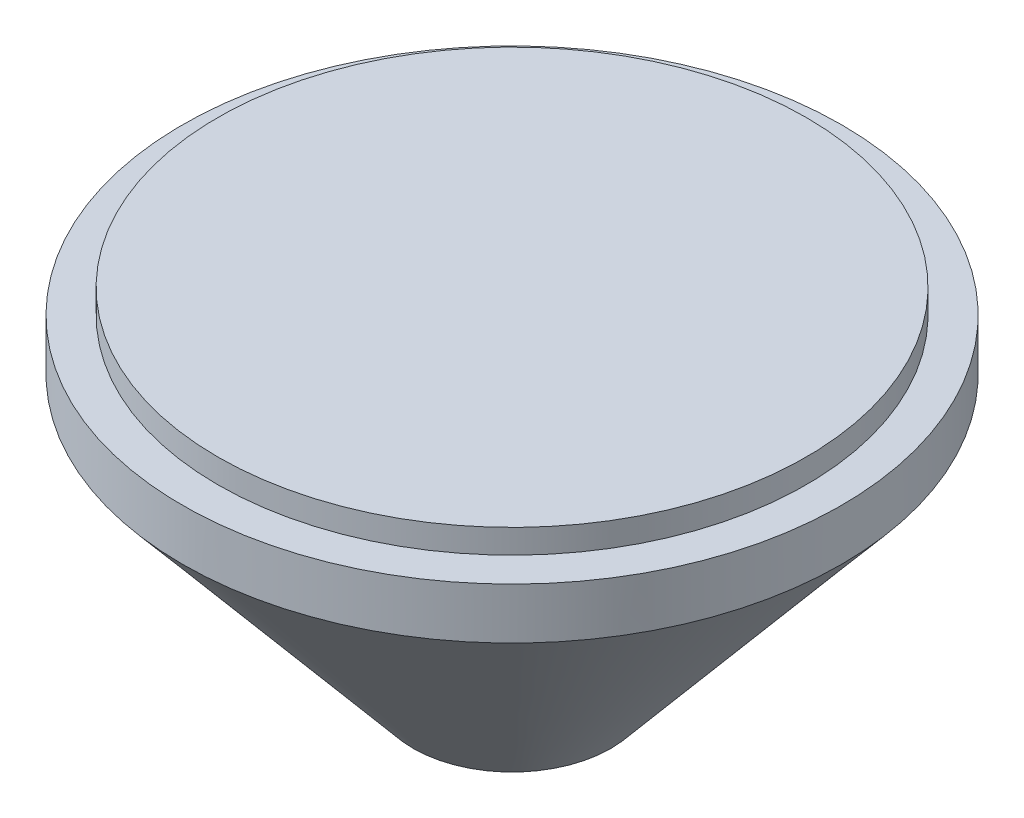
ISO-10303-21;
HEADER;
FILE_DESCRIPTION(('STEP AP214'),'2;1');
FILE_NAME('part.step','',(''),(''),'','','');
FILE_SCHEMA(('AUTOMOTIVE_DESIGN { 1 0 10303 214 1 1 1 1 }'));
ENDSEC;
DATA;
#1=APPLICATION_CONTEXT('core data for automotive mechanical design processes');
#2=APPLICATION_PROTOCOL_DEFINITION('international standard','automotive_design',2000,#1);
#3=PRODUCT_CONTEXT('',#1,'mechanical');
#4=PRODUCT('Part','Part','',(#3));
#5=PRODUCT_RELATED_PRODUCT_CATEGORY('part','',(#4));
#6=PRODUCT_DEFINITION_FORMATION('','',#4);
#7=PRODUCT_DEFINITION_CONTEXT('part definition',#1,'design');
#8=PRODUCT_DEFINITION('design','',#6,#7);
#9=PRODUCT_DEFINITION_SHAPE('','',#8);
#10=(LENGTH_UNIT() NAMED_UNIT(*) SI_UNIT(.MILLI.,.METRE.));
#11=(NAMED_UNIT(*) PLANE_ANGLE_UNIT() SI_UNIT($,.RADIAN.));
#12=(NAMED_UNIT(*) SI_UNIT($,.STERADIAN.) SOLID_ANGLE_UNIT());
#13=UNCERTAINTY_MEASURE_WITH_UNIT(LENGTH_MEASURE(1.E-05),#10,'distance_accuracy_value','');
#14=(GEOMETRIC_REPRESENTATION_CONTEXT(3) GLOBAL_UNCERTAINTY_ASSIGNED_CONTEXT((#13)) GLOBAL_UNIT_ASSIGNED_CONTEXT((#10,
#11,#12)) REPRESENTATION_CONTEXT('',''));
#15=CARTESIAN_POINT('',(0.,0.,0.));
#16=DIRECTION('',(0.,0.,1.));
#17=DIRECTION('',(1.,0.,0.));
#18=AXIS2_PLACEMENT_3D('',#15,#16,#17);
#19=CARTESIAN_POINT('',(0.,8.34000000000001,0.));
#20=DIRECTION('',(0.,1.,0.));
#21=DIRECTION('',(0.,0.,1.));
#22=AXIS2_PLACEMENT_3D('',#19,#20,#21);
#23=CONICAL_SURFACE('',#22,10.,0.698266013208769);
#24=CARTESIAN_POINT('',(0.,0.,0.));
#25=DIRECTION('',(0.,-1.,0.));
#26=DIRECTION('',(0.,0.,-1.));
#27=AXIS2_PLACEMENT_3D('',#24,#25,#26);
#28=CIRCLE('',#27,3.);
#29=CARTESIAN_POINT('',(0.,0.,3.));
#30=VERTEX_POINT('',#29);
#31=EDGE_CURVE('E50',#30,#30,#28,.T.);
#32=CARTESIAN_POINT('',(0.,8.34000000000001,0.));
#33=DIRECTION('',(0.,-1.,0.));
#34=DIRECTION('',(0.,0.,-1.));
#35=AXIS2_PLACEMENT_3D('',#32,#33,#34);
#36=CIRCLE('',#35,10.);
#37=CARTESIAN_POINT('',(0.,8.34000000000001,10.));
#38=VERTEX_POINT('',#37);
#39=EDGE_CURVE('E47',#38,#38,#36,.T.);
#40=CARTESIAN_POINT('',(0.,0.,3.));
#41=CARTESIAN_POINT('',(0.,0.0868750000000021,3.07291666666667));
#42=CARTESIAN_POINT('',(0.,0.173750000000002,3.14583333333333));
#43=CARTESIAN_POINT('',(0.,0.347500000000002,3.29166666666667));
#44=CARTESIAN_POINT('',(0.,0.434375000000002,3.36458333333333));
#45=CARTESIAN_POINT('',(0.,0.608125000000003,3.51041666666667));
#46=CARTESIAN_POINT('',(0.,0.695000000000003,3.58333333333333));
#47=CARTESIAN_POINT('',(0.,0.868750000000002,3.72916666666667));
#48=CARTESIAN_POINT('',(0.,0.955625000000002,3.80208333333333));
#49=CARTESIAN_POINT('',(0.,1.129375,3.94791666666667));
#50=CARTESIAN_POINT('',(0.,1.21625,4.02083333333333));
#51=CARTESIAN_POINT('',(0.,1.39,4.16666666666667));
#52=CARTESIAN_POINT('',(0.,1.476875,4.23958333333333));
#53=CARTESIAN_POINT('',(0.,1.650625,4.38541666666667));
#54=CARTESIAN_POINT('',(0.,1.7375,4.45833333333333));
#55=CARTESIAN_POINT('',(0.,1.91125,4.60416666666667));
#56=CARTESIAN_POINT('',(0.,1.998125,4.67708333333333));
#57=CARTESIAN_POINT('',(0.,2.171875,4.82291666666667));
#58=CARTESIAN_POINT('',(0.,2.25875,4.89583333333333));
#59=CARTESIAN_POINT('',(0.,2.4325,5.04166666666667));
#60=CARTESIAN_POINT('',(0.,2.519375,5.11458333333333));
#61=CARTESIAN_POINT('',(0.,2.693125,5.26041666666667));
#62=CARTESIAN_POINT('',(0.,2.78,5.33333333333333));
#63=CARTESIAN_POINT('',(0.,2.95375,5.47916666666667));
#64=CARTESIAN_POINT('',(0.,3.040625,5.55208333333333));
#65=CARTESIAN_POINT('',(0.,3.214375,5.69791666666667));
#66=CARTESIAN_POINT('',(0.,3.30125,5.77083333333333));
#67=CARTESIAN_POINT('',(0.,3.475,5.91666666666667));
#68=CARTESIAN_POINT('',(0.,3.561875,5.98958333333333));
#69=CARTESIAN_POINT('',(0.,3.735625,6.13541666666667));
#70=CARTESIAN_POINT('',(0.,3.8225,6.20833333333333));
#71=CARTESIAN_POINT('',(0.,3.99625,6.35416666666667));
#72=CARTESIAN_POINT('',(0.,4.083125,6.42708333333333));
#73=CARTESIAN_POINT('',(0.,4.256875,6.57291666666667));
#74=CARTESIAN_POINT('',(0.,4.34375,6.64583333333333));
#75=CARTESIAN_POINT('',(0.,4.5175,6.79166666666667));
#76=CARTESIAN_POINT('',(0.,4.604375,6.86458333333333));
#77=CARTESIAN_POINT('',(0.,4.778125,7.01041666666667));
#78=CARTESIAN_POINT('',(0.,4.865,7.08333333333333));
#79=CARTESIAN_POINT('',(0.,5.03875,7.22916666666667));
#80=CARTESIAN_POINT('',(0.,5.125625,7.30208333333333));
#81=CARTESIAN_POINT('',(0.,5.299375,7.44791666666667));
#82=CARTESIAN_POINT('',(0.,5.38625,7.52083333333333));
#83=CARTESIAN_POINT('',(0.,5.56,7.66666666666667));
#84=CARTESIAN_POINT('',(0.,5.646875,7.73958333333334));
#85=CARTESIAN_POINT('',(0.,5.82062500000001,7.88541666666667));
#86=CARTESIAN_POINT('',(0.,5.9075,7.95833333333333));
#87=CARTESIAN_POINT('',(0.,6.08125,8.10416666666667));
#88=CARTESIAN_POINT('',(0.,6.168125,8.17708333333334));
#89=CARTESIAN_POINT('',(0.,6.341875,8.32291666666667));
#90=CARTESIAN_POINT('',(0.,6.42875,8.39583333333334));
#91=CARTESIAN_POINT('',(0.,6.60250000000001,8.54166666666667));
#92=CARTESIAN_POINT('',(0.,6.689375,8.61458333333334));
#93=CARTESIAN_POINT('',(0.,6.863125,8.76041666666667));
#94=CARTESIAN_POINT('',(0.,6.95,8.83333333333333));
#95=CARTESIAN_POINT('',(0.,7.12375,8.97916666666667));
#96=CARTESIAN_POINT('',(0.,7.21062500000001,9.05208333333334));
#97=CARTESIAN_POINT('',(0.,7.384375,9.19791666666667));
#98=CARTESIAN_POINT('',(0.,7.47125,9.27083333333334));
#99=CARTESIAN_POINT('',(0.,7.645,9.41666666666667));
#100=CARTESIAN_POINT('',(0.,7.731875,9.48958333333333));
#101=CARTESIAN_POINT('',(0.,7.90562500000001,9.63541666666667));
#102=CARTESIAN_POINT('',(0.,7.99250000000001,9.70833333333333));
#103=CARTESIAN_POINT('',(0.,8.16625000000001,9.85416666666667));
#104=CARTESIAN_POINT('',(0.,8.25312500000001,9.92708333333333));
#105=CARTESIAN_POINT('',(0.,8.34000000000001,10.));
#106=B_SPLINE_CURVE_WITH_KNOTS('',3,(#40,#41,#42,#43,#44,#45,#46,#47,#48,#49,#50,#51,#52,#53,
#54,#55,#56,#57,#58,#59,#60,#61,#62,#63,#64,#65,#66,#67,#68,#69,#70,#71,#72,#73,#74,#75,#76,#77,
#78,#79,#80,#81,#82,#83,#84,#85,#86,#87,#88,#89,#90,#91,#92,#93,#94,#95,#96,#97,#98,#99,#100,
#101,#102,#103,#104,#105),.UNSPECIFIED.,.F.,.F.,(4,2,2,2,2,2,2,2,2,2,2,2,2,2,2,2,2,2,2,2,2,2,2,
2,2,2,2,2,2,2,2,2,4),(0.,0.340260125675931,0.680520251351862,1.02078037702779,1.36104050270372,
1.70130062837965,2.04156075405558,2.38182087973151,2.72208100540744,3.06234113108337,
3.40260125675931,3.74286138243524,4.08312150811117,4.4233816337871,4.76364175946303,
5.10390188513896,5.44416201081489,5.78442213649082,6.12468226216675,6.46494238784268,
6.80520251351861,7.14546263919454,7.48572276487047,7.8259828905464,8.16624301622234,
8.50650314189827,8.8467632675742,9.18702339325013,9.52728351892606,9.86754364460199,
10.2078037702779,10.5480638959539,10.8883240216298),.UNSPECIFIED.);
#107=EDGE_CURVE('BSEAM30',#30,#38,#106,.T.);
#108=ORIENTED_EDGE('',*,*,#31,.F.);
#109=ORIENTED_EDGE('',*,*,#39,.T.);
#110=ORIENTED_EDGE('',*,*,#107,.T.);
#111=ORIENTED_EDGE('',*,*,#107,.F.);
#112=EDGE_LOOP('',(#108,#110,#109,#111));
#113=FACE_BOUND('',#112,.T.);
#114=ADVANCED_FACE('F30',(#113),#23,.T.);
#115=CARTESIAN_POINT('',(0.,10.62,0.));
#116=DIRECTION('',(0.,-1.,0.));
#117=DIRECTION('',(0.,0.,-1.));
#118=AXIS2_PLACEMENT_3D('',#115,#116,#117);
#119=CYLINDRICAL_SURFACE('',#118,10.);
#120=ORIENTED_EDGE('',*,*,#39,.F.);
#121=EDGE_LOOP('',(#120));
#122=FACE_BOUND('',#121,.T.);
#123=CARTESIAN_POINT('',(0.,9.89,0.));
#124=DIRECTION('',(0.,-1.,0.));
#125=DIRECTION('',(0.,0.,-1.));
#126=AXIS2_PLACEMENT_3D('',#123,#124,#125);
#127=CIRCLE('',#126,10.);
#128=CARTESIAN_POINT('',(0.,9.89,-10.));
#129=VERTEX_POINT('',#128);
#130=EDGE_CURVE('E42',#129,#129,#127,.T.);
#131=ORIENTED_EDGE('',*,*,#130,.T.);
#132=EDGE_LOOP('',(#131));
#133=FACE_BOUND('',#132,.T.);
#134=ADVANCED_FACE('F71',(#122,#133),#119,.T.);
#135=CARTESIAN_POINT('',(0.,0.,0.));
#136=DIRECTION('',(0.,-1.,0.));
#137=DIRECTION('',(0.,0.,-1.));
#138=AXIS2_PLACEMENT_3D('',#135,#136,#137);
#139=CYLINDRICAL_SURFACE('',#138,8.925);
#140=CARTESIAN_POINT('',(0.,9.89,0.));
#141=DIRECTION('',(0.,-1.,0.));
#142=DIRECTION('',(0.,0.,-1.));
#143=AXIS2_PLACEMENT_3D('',#140,#141,#142);
#144=CIRCLE('',#143,8.925);
#145=CARTESIAN_POINT('',(0.,9.89,-8.925));
#146=VERTEX_POINT('',#145);
#147=EDGE_CURVE('E38',#146,#146,#144,.T.);
#148=ORIENTED_EDGE('',*,*,#147,.F.);
#149=EDGE_LOOP('',(#148));
#150=FACE_BOUND('',#149,.T.);
#151=CARTESIAN_POINT('',(0.,10.62,0.));
#152=DIRECTION('',(0.,-1.,0.));
#153=DIRECTION('',(0.,0.,-1.));
#154=AXIS2_PLACEMENT_3D('',#151,#152,#153);
#155=CIRCLE('',#154,8.925);
#156=CARTESIAN_POINT('',(0.,10.62,-8.925));
#157=VERTEX_POINT('',#156);
#158=EDGE_CURVE('E10',#157,#157,#155,.T.);
#159=ORIENTED_EDGE('',*,*,#158,.T.);
#160=EDGE_LOOP('',(#159));
#161=FACE_BOUND('',#160,.T.);
#162=ADVANCED_FACE('F76',(#150,#161),#139,.T.);
#163=CARTESIAN_POINT('',(0.,9.89,0.));
#164=DIRECTION('',(0.,1.,0.));
#165=DIRECTION('',(0.,0.,1.));
#166=AXIS2_PLACEMENT_3D('',#163,#164,#165);
#167=PLANE('',#166);
#168=ORIENTED_EDGE('',*,*,#147,.T.);
#169=EDGE_LOOP('',(#168));
#170=FACE_BOUND('',#169,.T.);
#171=ORIENTED_EDGE('',*,*,#130,.F.);
#172=EDGE_LOOP('',(#171));
#173=FACE_BOUND('',#172,.T.);
#174=ADVANCED_FACE('F66',(#170,#173),#167,.T.);
#175=CARTESIAN_POINT('',(0.,10.62,0.));
#176=DIRECTION('',(0.,1.,0.));
#177=DIRECTION('',(0.,0.,1.));
#178=AXIS2_PLACEMENT_3D('',#175,#176,#177);
#179=PLANE('',#178);
#180=ORIENTED_EDGE('',*,*,#158,.F.);
#181=EDGE_LOOP('',(#180));
#182=FACE_BOUND('',#181,.T.);
#183=ADVANCED_FACE('F60',(#182),#179,.T.);
#184=CARTESIAN_POINT('',(0.,0.,0.));
#185=DIRECTION('',(0.,-1.,0.));
#186=DIRECTION('',(0.,0.,-1.));
#187=AXIS2_PLACEMENT_3D('',#184,#185,#186);
#188=CONICAL_SURFACE('',#187,3.,0.0392699081698725);
#189=CARTESIAN_POINT('',(0.,5.,0.));
#190=DIRECTION('',(0.,-1.,0.));
#191=DIRECTION('',(0.,0.,-1.));
#192=AXIS2_PLACEMENT_3D('',#189,#190,#191);
#193=CIRCLE('',#192,2.80354946496165);
#194=CARTESIAN_POINT('',(0.,5.,-2.80354946496165));
#195=VERTEX_POINT('',#194);
#196=EDGE_CURVE('E34',#195,#195,#193,.T.);
#197=ORIENTED_EDGE('',*,*,#196,.F.);
#198=EDGE_LOOP('',(#197));
#199=FACE_BOUND('',#198,.T.);
#200=ORIENTED_EDGE('',*,*,#31,.T.);
#201=EDGE_LOOP('',(#200));
#202=FACE_BOUND('',#201,.T.);
#203=ADVANCED_FACE('F58',(#199,#202),#188,.F.);
#204=CARTESIAN_POINT('',(0.,8.42994480124338,0.));
#205=DIRECTION('',(0.,0.,1.));
#206=DIRECTION('',(1.,0.,0.));
#207=AXIS2_PLACEMENT_3D('',#204,#205,#206);
#208=SPHERICAL_SURFACE('',#207,4.42994480124338);
#209=CARTESIAN_POINT('',(0.,8.42994480124338,0.));
#210=DIRECTION('',(0.,-1.,0.));
#211=DIRECTION('',(0.,0.,-1.));
#212=AXIS2_PLACEMENT_3D('',#209,#210,#211);
#213=SPHERICAL_SURFACE('',#212,4.42994480124338);
#214=ORIENTED_EDGE('',*,*,#196,.T.);
#215=EDGE_LOOP('',(#214));
#216=FACE_BOUND('',#215,.T.);
#217=ADVANCED_FACE('F32',(#216),#213,.T.);
#218=CLOSED_SHELL('',(#114,#134,#162,#174,#183,#203,#217));
#219=MANIFOLD_SOLID_BREP('B2',#218);
#220=ADVANCED_BREP_SHAPE_REPRESENTATION('',(#18,#219),#14);
#221=SHAPE_DEFINITION_REPRESENTATION(#9,#220);
ENDSEC;
END-ISO-10303-21;
